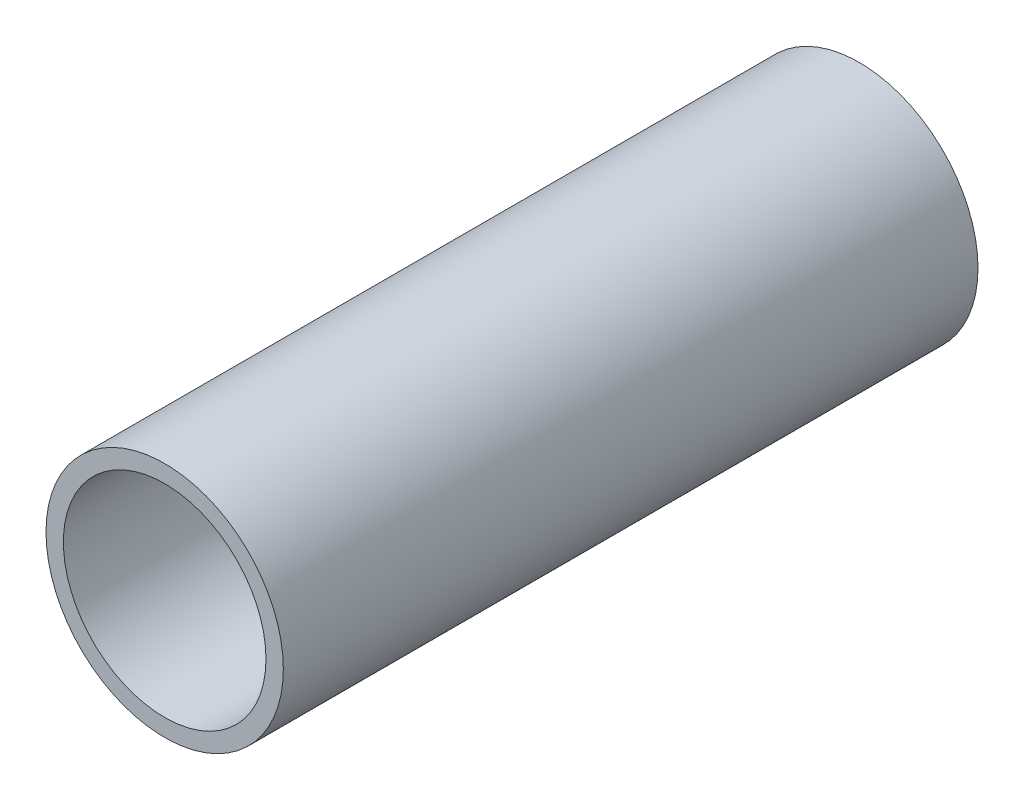
ISO-10303-21;
HEADER;
FILE_DESCRIPTION(('STEP AP214'),'2;1');
FILE_NAME('part.step','',(''),(''),'','','');
FILE_SCHEMA(('AUTOMOTIVE_DESIGN { 1 0 10303 214 1 1 1 1 }'));
ENDSEC;
DATA;
#1=APPLICATION_CONTEXT('core data for automotive mechanical design processes');
#2=APPLICATION_PROTOCOL_DEFINITION('international standard','automotive_design',2000,#1);
#3=PRODUCT_CONTEXT('',#1,'mechanical');
#4=PRODUCT('Part','Part','',(#3));
#5=PRODUCT_RELATED_PRODUCT_CATEGORY('part','',(#4));
#6=PRODUCT_DEFINITION_FORMATION('','',#4);
#7=PRODUCT_DEFINITION_CONTEXT('part definition',#1,'design');
#8=PRODUCT_DEFINITION('design','',#6,#7);
#9=PRODUCT_DEFINITION_SHAPE('','',#8);
#10=(LENGTH_UNIT() NAMED_UNIT(*) SI_UNIT(.MILLI.,.METRE.));
#11=(NAMED_UNIT(*) PLANE_ANGLE_UNIT() SI_UNIT($,.RADIAN.));
#12=(NAMED_UNIT(*) SI_UNIT($,.STERADIAN.) SOLID_ANGLE_UNIT());
#13=UNCERTAINTY_MEASURE_WITH_UNIT(LENGTH_MEASURE(1.E-05),#10,'distance_accuracy_value','');
#14=(GEOMETRIC_REPRESENTATION_CONTEXT(3) GLOBAL_UNCERTAINTY_ASSIGNED_CONTEXT((#13)) GLOBAL_UNIT_ASSIGNED_CONTEXT((#10,
#11,#12)) REPRESENTATION_CONTEXT('',''));
#15=CARTESIAN_POINT('',(0.,0.,0.));
#16=DIRECTION('',(0.,0.,1.));
#17=DIRECTION('',(1.,0.,0.));
#18=AXIS2_PLACEMENT_3D('',#15,#16,#17);
#19=CARTESIAN_POINT('',(0.,0.,120.));
#20=DIRECTION('',(0.,0.,-1.));
#21=DIRECTION('',(-1.,0.,0.));
#22=AXIS2_PLACEMENT_3D('',#19,#20,#21);
#23=CYLINDRICAL_SURFACE('',#22,20.5);
#24=CARTESIAN_POINT('',(0.,0.,120.));
#25=DIRECTION('',(0.,0.,1.));
#26=DIRECTION('',(1.,0.,0.));
#27=AXIS2_PLACEMENT_3D('',#24,#25,#26);
#28=CIRCLE('',#27,20.5);
#29=CARTESIAN_POINT('',(20.5,0.,120.));
#30=VERTEX_POINT('',#29);
#31=EDGE_CURVE('E10',#30,#30,#28,.T.);
#32=ORIENTED_EDGE('',*,*,#31,.F.);
#33=EDGE_LOOP('',(#32));
#34=FACE_BOUND('',#33,.T.);
#35=CARTESIAN_POINT('',(0.,0.,0.));
#36=DIRECTION('',(0.,0.,1.));
#37=DIRECTION('',(1.,0.,0.));
#38=AXIS2_PLACEMENT_3D('',#35,#36,#37);
#39=CIRCLE('',#38,20.5);
#40=CARTESIAN_POINT('',(20.5,0.,0.));
#41=VERTEX_POINT('',#40);
#42=EDGE_CURVE('E38',#41,#41,#39,.T.);
#43=ORIENTED_EDGE('',*,*,#42,.T.);
#44=EDGE_LOOP('',(#43));
#45=FACE_BOUND('',#44,.T.);
#46=ADVANCED_FACE('F31',(#34,#45),#23,.T.);
#47=CARTESIAN_POINT('',(0.,0.,120.));
#48=DIRECTION('',(0.,0.,1.));
#49=DIRECTION('',(1.,0.,0.));
#50=AXIS2_PLACEMENT_3D('',#47,#48,#49);
#51=PLANE('',#50);
#52=CARTESIAN_POINT('',(0.,0.,120.));
#53=DIRECTION('',(0.,0.,1.));
#54=DIRECTION('',(1.,0.,0.));
#55=AXIS2_PLACEMENT_3D('',#52,#53,#54);
#56=CIRCLE('',#55,17.5);
#57=CARTESIAN_POINT('',(17.5,0.,120.));
#58=VERTEX_POINT('',#57);
#59=EDGE_CURVE('E44',#58,#58,#56,.T.);
#60=ORIENTED_EDGE('',*,*,#59,.F.);
#61=EDGE_LOOP('',(#60));
#62=FACE_BOUND('',#61,.T.);
#63=ORIENTED_EDGE('',*,*,#31,.T.);
#64=EDGE_LOOP('',(#63));
#65=FACE_BOUND('',#64,.T.);
#66=ADVANCED_FACE('F60',(#62,#65),#51,.T.);
#67=CARTESIAN_POINT('',(0.,0.,0.));
#68=DIRECTION('',(0.,0.,1.));
#69=DIRECTION('',(1.,0.,0.));
#70=AXIS2_PLACEMENT_3D('',#67,#68,#69);
#71=PLANE('',#70);
#72=CARTESIAN_POINT('',(0.,0.,0.));
#73=DIRECTION('',(0.,0.,1.));
#74=DIRECTION('',(1.,0.,0.));
#75=AXIS2_PLACEMENT_3D('',#72,#73,#74);
#76=CIRCLE('',#75,17.5);
#77=CARTESIAN_POINT('',(17.5,0.,0.));
#78=VERTEX_POINT('',#77);
#79=EDGE_CURVE('E34',#78,#78,#76,.T.);
#80=ORIENTED_EDGE('',*,*,#79,.T.);
#81=EDGE_LOOP('',(#80));
#82=FACE_BOUND('',#81,.T.);
#83=ORIENTED_EDGE('',*,*,#42,.F.);
#84=EDGE_LOOP('',(#83));
#85=FACE_BOUND('',#84,.T.);
#86=ADVANCED_FACE('F51',(#82,#85),#71,.F.);
#87=CARTESIAN_POINT('',(0.,0.,-35.));
#88=DIRECTION('',(0.,0.,1.));
#89=DIRECTION('',(1.,0.,0.));
#90=AXIS2_PLACEMENT_3D('',#87,#88,#89);
#91=CYLINDRICAL_SURFACE('',#90,17.5);
#92=ORIENTED_EDGE('',*,*,#59,.T.);
#93=EDGE_LOOP('',(#92));
#94=FACE_BOUND('',#93,.T.);
#95=ORIENTED_EDGE('',*,*,#79,.F.);
#96=EDGE_LOOP('',(#95));
#97=FACE_BOUND('',#96,.T.);
#98=ADVANCED_FACE('F54',(#94,#97),#91,.F.);
#99=CLOSED_SHELL('',(#46,#66,#86,#98));
#100=MANIFOLD_SOLID_BREP('B2',#99);
#101=ADVANCED_BREP_SHAPE_REPRESENTATION('',(#18,#100),#14);
#102=SHAPE_DEFINITION_REPRESENTATION(#9,#101);
ENDSEC;
END-ISO-10303-21;
